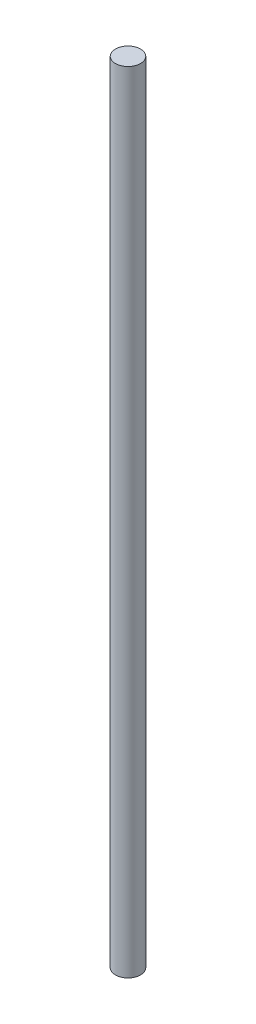
ISO-10303-21;
HEADER;
FILE_DESCRIPTION(('STEP AP214'),'2;1');
FILE_NAME('part.step','',(''),(''),'','','');
FILE_SCHEMA(('AUTOMOTIVE_DESIGN { 1 0 10303 214 1 1 1 1 }'));
ENDSEC;
DATA;
#1=APPLICATION_CONTEXT('core data for automotive mechanical design processes');
#2=APPLICATION_PROTOCOL_DEFINITION('international standard','automotive_design',2000,#1);
#3=PRODUCT_CONTEXT('',#1,'mechanical');
#4=PRODUCT('Part','Part','',(#3));
#5=PRODUCT_RELATED_PRODUCT_CATEGORY('part','',(#4));
#6=PRODUCT_DEFINITION_FORMATION('','',#4);
#7=PRODUCT_DEFINITION_CONTEXT('part definition',#1,'design');
#8=PRODUCT_DEFINITION('design','',#6,#7);
#9=PRODUCT_DEFINITION_SHAPE('','',#8);
#10=(LENGTH_UNIT() NAMED_UNIT(*) SI_UNIT(.MILLI.,.METRE.));
#11=(NAMED_UNIT(*) PLANE_ANGLE_UNIT() SI_UNIT($,.RADIAN.));
#12=(NAMED_UNIT(*) SI_UNIT($,.STERADIAN.) SOLID_ANGLE_UNIT());
#13=UNCERTAINTY_MEASURE_WITH_UNIT(LENGTH_MEASURE(1.E-05),#10,'distance_accuracy_value','');
#14=(GEOMETRIC_REPRESENTATION_CONTEXT(3) GLOBAL_UNCERTAINTY_ASSIGNED_CONTEXT((#13)) GLOBAL_UNIT_ASSIGNED_CONTEXT((#10,
#11,#12)) REPRESENTATION_CONTEXT('',''));
#15=CARTESIAN_POINT('',(0.,0.,0.));
#16=DIRECTION('',(0.,0.,1.));
#17=DIRECTION('',(1.,0.,0.));
#18=AXIS2_PLACEMENT_3D('',#15,#16,#17);
#19=CARTESIAN_POINT('',(0.,157.,0.));
#20=DIRECTION('',(0.,-1.,0.));
#21=DIRECTION('',(0.,0.,-1.));
#22=AXIS2_PLACEMENT_3D('',#19,#20,#21);
#23=CYLINDRICAL_SURFACE('',#22,2.5);
#24=CARTESIAN_POINT('',(0.,157.,0.));
#25=DIRECTION('',(0.,1.,0.));
#26=DIRECTION('',(0.,0.,1.));
#27=AXIS2_PLACEMENT_3D('',#24,#25,#26);
#28=CIRCLE('',#27,2.5);
#29=CARTESIAN_POINT('',(0.,157.,2.5));
#30=VERTEX_POINT('',#29);
#31=EDGE_CURVE('E10',#30,#30,#28,.T.);
#32=ORIENTED_EDGE('',*,*,#31,.F.);
#33=EDGE_LOOP('',(#32));
#34=FACE_BOUND('',#33,.T.);
#35=CARTESIAN_POINT('',(0.,0.,0.));
#36=DIRECTION('',(0.,1.,0.));
#37=DIRECTION('',(0.,0.,1.));
#38=AXIS2_PLACEMENT_3D('',#35,#36,#37);
#39=CIRCLE('',#38,2.5);
#40=CARTESIAN_POINT('',(0.,0.,2.5));
#41=VERTEX_POINT('',#40);
#42=EDGE_CURVE('E32',#41,#41,#39,.T.);
#43=ORIENTED_EDGE('',*,*,#42,.T.);
#44=EDGE_LOOP('',(#43));
#45=FACE_BOUND('',#44,.T.);
#46=ADVANCED_FACE('F29',(#34,#45),#23,.T.);
#47=CARTESIAN_POINT('',(0.,157.,0.));
#48=DIRECTION('',(0.,1.,0.));
#49=DIRECTION('',(0.,0.,1.));
#50=AXIS2_PLACEMENT_3D('',#47,#48,#49);
#51=PLANE('',#50);
#52=ORIENTED_EDGE('',*,*,#31,.T.);
#53=EDGE_LOOP('',(#52));
#54=FACE_BOUND('',#53,.T.);
#55=ADVANCED_FACE('F44',(#54),#51,.T.);
#56=CARTESIAN_POINT('',(0.,0.,0.));
#57=DIRECTION('',(0.,1.,0.));
#58=DIRECTION('',(0.,0.,1.));
#59=AXIS2_PLACEMENT_3D('',#56,#57,#58);
#60=PLANE('',#59);
#61=ORIENTED_EDGE('',*,*,#42,.F.);
#62=EDGE_LOOP('',(#61));
#63=FACE_BOUND('',#62,.T.);
#64=ADVANCED_FACE('F42',(#63),#60,.F.);
#65=CLOSED_SHELL('',(#46,#55,#64));
#66=MANIFOLD_SOLID_BREP('B2',#65);
#67=ADVANCED_BREP_SHAPE_REPRESENTATION('',(#18,#66),#14);
#68=SHAPE_DEFINITION_REPRESENTATION(#9,#67);
ENDSEC;
END-ISO-10303-21;
